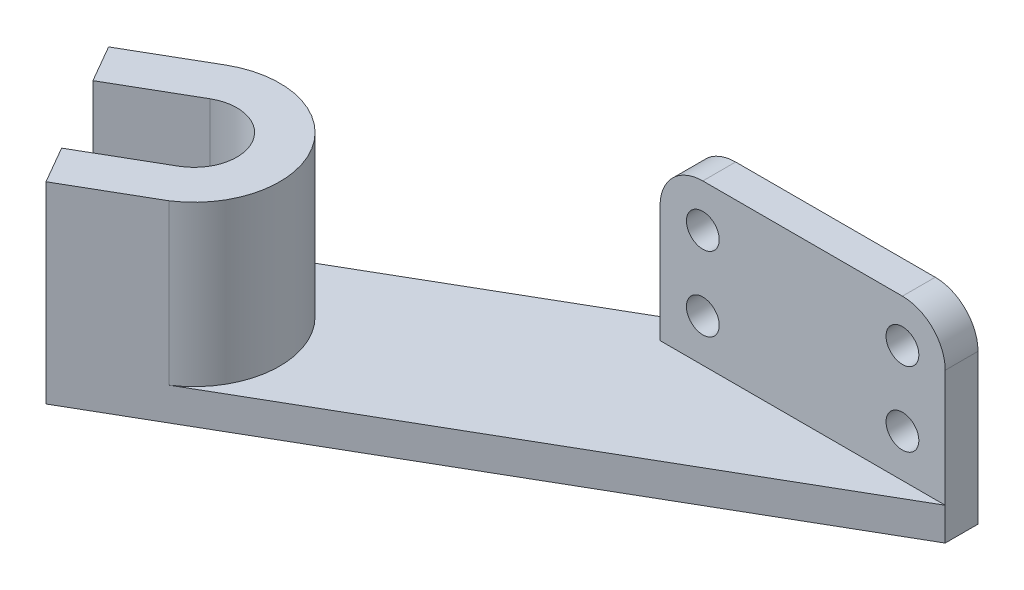
ISO-10303-21;
HEADER;
FILE_DESCRIPTION(('STEP AP214'),'2;1');
FILE_NAME('part.step','',(''),(''),'','','');
FILE_SCHEMA(('AUTOMOTIVE_DESIGN { 1 0 10303 214 1 1 1 1 }'));
ENDSEC;
DATA;
#1=APPLICATION_CONTEXT('core data for automotive mechanical design processes');
#2=APPLICATION_PROTOCOL_DEFINITION('international standard','automotive_design',2000,#1);
#3=PRODUCT_CONTEXT('',#1,'mechanical');
#4=PRODUCT('Part','Part','',(#3));
#5=PRODUCT_RELATED_PRODUCT_CATEGORY('part','',(#4));
#6=PRODUCT_DEFINITION_FORMATION('','',#4);
#7=PRODUCT_DEFINITION_CONTEXT('part definition',#1,'design');
#8=PRODUCT_DEFINITION('design','',#6,#7);
#9=PRODUCT_DEFINITION_SHAPE('','',#8);
#10=(LENGTH_UNIT() NAMED_UNIT(*) SI_UNIT(.MILLI.,.METRE.));
#11=(NAMED_UNIT(*) PLANE_ANGLE_UNIT() SI_UNIT($,.RADIAN.));
#12=(NAMED_UNIT(*) SI_UNIT($,.STERADIAN.) SOLID_ANGLE_UNIT());
#13=UNCERTAINTY_MEASURE_WITH_UNIT(LENGTH_MEASURE(1.E-05),#10,'distance_accuracy_value','');
#14=(GEOMETRIC_REPRESENTATION_CONTEXT(3) GLOBAL_UNCERTAINTY_ASSIGNED_CONTEXT((#13)) GLOBAL_UNIT_ASSIGNED_CONTEXT((#10,
#11,#12)) REPRESENTATION_CONTEXT('',''));
#15=CARTESIAN_POINT('',(0.,0.,0.));
#16=DIRECTION('',(0.,0.,1.));
#17=DIRECTION('',(1.,0.,0.));
#18=AXIS2_PLACEMENT_3D('',#15,#16,#17);
#19=CARTESIAN_POINT('',(-138.923048454132,-22.25,80.2307621135346));
#20=DIRECTION('',(0.,-1.,0.));
#21=DIRECTION('',(0.,0.,-1.));
#22=AXIS2_PLACEMENT_3D('',#19,#20,#21);
#23=PLANE('',#22);
#24=CARTESIAN_POINT('',(-138.923048454132,-22.25,80.2307621135346));
#25=DIRECTION('',(0.,1.,0.));
#26=DIRECTION('',(0.,0.,1.));
#27=AXIS2_PLACEMENT_3D('',#24,#25,#26);
#28=CIRCLE('',#27,30.0000000000023);
#29=CARTESIAN_POINT('',(-122.590401756136,-22.25,105.395114913449));
#30=VERTEX_POINT('',#29);
#31=CARTESIAN_POINT('',(-153.923048454133,-22.25,54.2499999999994));
#32=VERTEX_POINT('',#31);
#33=EDGE_CURVE('E50',#30,#32,#28,.T.);
#34=ORIENTED_EDGE('',*,*,#33,.F.);
#35=DIRECTION('',(-0.866025403784442,0.,0.499999999999995));
#36=VECTOR('',#35,1.);
#37=CARTESIAN_POINT('',(50.,-22.25,5.75));
#38=LINE('',#37,#36);
#39=CARTESIAN_POINT('',(50.,-22.25,5.75));
#40=VERTEX_POINT('',#39);
#41=EDGE_CURVE('E165',#40,#30,#38,.T.);
#42=ORIENTED_EDGE('',*,*,#41,.F.);
#43=DIRECTION('',(1.,0.,0.));
#44=VECTOR('',#43,1.);
#45=CARTESIAN_POINT('',(-50.,-22.25,5.75));
#46=LINE('',#45,#44);
#47=CARTESIAN_POINT('',(-50.,-22.25,5.75));
#48=VERTEX_POINT('',#47);
#49=EDGE_CURVE('E174',#48,#40,#46,.T.);
#50=ORIENTED_EDGE('',*,*,#49,.F.);
#51=DIRECTION('',(0.,0.,1.));
#52=VECTOR('',#51,1.);
#53=CARTESIAN_POINT('',(-50.,-22.25,-5.75));
#54=LINE('',#53,#52);
#55=CARTESIAN_POINT('',(-50.,-22.25,-5.75));
#56=VERTEX_POINT('',#55);
#57=EDGE_CURVE('E179',#56,#48,#54,.T.);
#58=ORIENTED_EDGE('',*,*,#57,.F.);
#59=DIRECTION('',(0.866025403784442,0.,-0.499999999999995));
#60=VECTOR('',#59,1.);
#61=CARTESIAN_POINT('',(-179.903810567666,-22.25,69.2499999999992));
#62=LINE('',#61,#60);
#63=EDGE_CURVE('E55',#32,#56,#62,.T.);
#64=ORIENTED_EDGE('',*,*,#63,.F.);
#65=EDGE_LOOP('',(#34,#42,#50,#58,#64));
#66=FACE_BOUND('',#65,.T.);
#67=ADVANCED_FACE('F35',(#66),#23,.F.);
#68=CARTESIAN_POINT('',(-50.,33.75,5.75));
#69=DIRECTION('',(1.,0.,0.));
#70=DIRECTION('',(0.,1.,0.));
#71=AXIS2_PLACEMENT_3D('',#68,#69,#70);
#72=PLANE('',#71);
#73=ORIENTED_EDGE('',*,*,#57,.T.);
#74=DIRECTION('',(0.,-1.,0.));
#75=VECTOR('',#74,1.);
#76=CARTESIAN_POINT('',(-50.,33.75,5.75));
#77=LINE('',#76,#75);
#78=CARTESIAN_POINT('',(-50.,18.75,5.75));
#79=VERTEX_POINT('',#78);
#80=EDGE_CURVE('E243',#79,#48,#77,.T.);
#81=ORIENTED_EDGE('',*,*,#80,.F.);
#82=DIRECTION('',(0.,0.,-1.));
#83=VECTOR('',#82,1.);
#84=CARTESIAN_POINT('',(-50.,18.75,5.75));
#85=LINE('',#84,#83);
#86=CARTESIAN_POINT('',(-50.,18.75,-5.75));
#87=VERTEX_POINT('',#86);
#88=EDGE_CURVE('E11',#79,#87,#85,.T.);
#89=ORIENTED_EDGE('',*,*,#88,.T.);
#90=DIRECTION('',(0.,-1.,0.));
#91=VECTOR('',#90,1.);
#92=CARTESIAN_POINT('',(-50.,33.75,-5.75));
#93=LINE('',#92,#91);
#94=EDGE_CURVE('E252',#87,#56,#93,.T.);
#95=ORIENTED_EDGE('',*,*,#94,.T.);
#96=EDGE_LOOP('',(#73,#81,#89,#95));
#97=FACE_BOUND('',#96,.T.);
#98=ADVANCED_FACE('F324',(#97),#72,.F.);
#99=CARTESIAN_POINT('',(0.,0.,5.75));
#100=DIRECTION('',(0.,0.,1.));
#101=DIRECTION('',(1.,0.,0.));
#102=AXIS2_PLACEMENT_3D('',#99,#100,#101);
#103=PLANE('',#102);
#104=CARTESIAN_POINT('',(-35.,18.75,5.75));
#105=DIRECTION('',(0.,0.,1.));
#106=DIRECTION('',(1.,0.,0.));
#107=AXIS2_PLACEMENT_3D('',#104,#105,#106);
#108=CIRCLE('',#107,5.74999999999999);
#109=CARTESIAN_POINT('',(-29.25,18.75,5.75));
#110=VERTEX_POINT('',#109);
#111=EDGE_CURVE('E197',#110,#110,#108,.T.);
#112=ORIENTED_EDGE('',*,*,#111,.F.);
#113=EDGE_LOOP('',(#112));
#114=FACE_BOUND('',#113,.T.);
#115=CARTESIAN_POINT('',(35.,18.75,5.75));
#116=DIRECTION('',(0.,0.,1.));
#117=DIRECTION('',(1.,0.,0.));
#118=AXIS2_PLACEMENT_3D('',#115,#116,#117);
#119=CIRCLE('',#118,5.74999999999999);
#120=CARTESIAN_POINT('',(40.75,18.75,5.75));
#121=VERTEX_POINT('',#120);
#122=EDGE_CURVE('E218',#121,#121,#119,.T.);
#123=ORIENTED_EDGE('',*,*,#122,.F.);
#124=EDGE_LOOP('',(#123));
#125=FACE_BOUND('',#124,.T.);
#126=CARTESIAN_POINT('',(-35.,-7.25000000000001,5.75));
#127=DIRECTION('',(0.,0.,1.));
#128=DIRECTION('',(1.,0.,0.));
#129=AXIS2_PLACEMENT_3D('',#126,#127,#128);
#130=CIRCLE('',#129,5.74999999999999);
#131=CARTESIAN_POINT('',(-29.25,-7.25000000000001,5.75));
#132=VERTEX_POINT('',#131);
#133=EDGE_CURVE('E224',#132,#132,#130,.T.);
#134=ORIENTED_EDGE('',*,*,#133,.F.);
#135=EDGE_LOOP('',(#134));
#136=FACE_BOUND('',#135,.T.);
#137=CARTESIAN_POINT('',(35.,-7.24999999999999,5.75));
#138=DIRECTION('',(0.,0.,1.));
#139=DIRECTION('',(1.,0.,0.));
#140=AXIS2_PLACEMENT_3D('',#137,#138,#139);
#141=CIRCLE('',#140,5.74999999999999);
#142=CARTESIAN_POINT('',(40.75,-7.24999999999999,5.75));
#143=VERTEX_POINT('',#142);
#144=EDGE_CURVE('E230',#143,#143,#141,.T.);
#145=ORIENTED_EDGE('',*,*,#144,.F.);
#146=EDGE_LOOP('',(#145));
#147=FACE_BOUND('',#146,.T.);
#148=ORIENTED_EDGE('',*,*,#80,.T.);
#149=ORIENTED_EDGE('',*,*,#49,.T.);
#150=DIRECTION('',(0.,1.,0.));
#151=VECTOR('',#150,1.);
#152=CARTESIAN_POINT('',(50.,33.75,5.75));
#153=LINE('',#152,#151);
#154=CARTESIAN_POINT('',(50.,18.75,5.75));
#155=VERTEX_POINT('',#154);
#156=EDGE_CURVE('E240',#40,#155,#153,.T.);
#157=ORIENTED_EDGE('',*,*,#156,.T.);
#158=CARTESIAN_POINT('',(35.,18.75,5.75));
#159=DIRECTION('',(0.,0.,1.));
#160=DIRECTION('',(1.,0.,0.));
#161=AXIS2_PLACEMENT_3D('',#158,#159,#160);
#162=CIRCLE('',#161,15.);
#163=CARTESIAN_POINT('',(35.,33.75,5.75));
#164=VERTEX_POINT('',#163);
#165=EDGE_CURVE('E43',#155,#164,#162,.T.);
#166=ORIENTED_EDGE('',*,*,#165,.T.);
#167=DIRECTION('',(-1.,0.,0.));
#168=VECTOR('',#167,1.);
#169=CARTESIAN_POINT('',(-50.,33.75,5.75));
#170=LINE('',#169,#168);
#171=CARTESIAN_POINT('',(-35.,33.75,5.75));
#172=VERTEX_POINT('',#171);
#173=EDGE_CURVE('E239',#164,#172,#170,.T.);
#174=ORIENTED_EDGE('',*,*,#173,.T.);
#175=CARTESIAN_POINT('',(-35.,18.75,5.75));
#176=DIRECTION('',(0.,0.,1.));
#177=DIRECTION('',(1.,0.,0.));
#178=AXIS2_PLACEMENT_3D('',#175,#176,#177);
#179=CIRCLE('',#178,15.);
#180=EDGE_CURVE('E271',#172,#79,#179,.T.);
#181=ORIENTED_EDGE('',*,*,#180,.T.);
#182=EDGE_LOOP('',(#148,#149,#157,#166,#174,#181));
#183=FACE_BOUND('',#182,.T.);
#184=ADVANCED_FACE('F275',(#114,#125,#136,#147,#183),#103,.T.);
#185=CARTESIAN_POINT('',(50.,33.75,5.75));
#186=DIRECTION('',(-1.,0.,0.));
#187=DIRECTION('',(0.,-1.,0.));
#188=AXIS2_PLACEMENT_3D('',#185,#186,#187);
#189=PLANE('',#188);
#190=DIRECTION('',(0.,1.,0.));
#191=VECTOR('',#190,1.);
#192=CARTESIAN_POINT('',(50.,33.75,-5.75));
#193=LINE('',#192,#191);
#194=CARTESIAN_POINT('',(50.,-33.75,-5.75));
#195=VERTEX_POINT('',#194);
#196=CARTESIAN_POINT('',(50.,18.75,-5.75));
#197=VERTEX_POINT('',#196);
#198=EDGE_CURVE('E236',#195,#197,#193,.T.);
#199=ORIENTED_EDGE('',*,*,#198,.T.);
#200=DIRECTION('',(0.,0.,-1.));
#201=VECTOR('',#200,1.);
#202=CARTESIAN_POINT('',(50.,18.75,5.75));
#203=LINE('',#202,#201);
#204=EDGE_CURVE('E268',#197,#155,#203,.F.);
#205=ORIENTED_EDGE('',*,*,#204,.T.);
#206=ORIENTED_EDGE('',*,*,#156,.F.);
#207=CARTESIAN_POINT('',(50.,-33.75,5.75));
#208=VERTEX_POINT('',#207);
#209=EDGE_CURVE('E237',#208,#40,#153,.T.);
#210=ORIENTED_EDGE('',*,*,#209,.F.);
#211=DIRECTION('',(0.,0.,-1.));
#212=VECTOR('',#211,1.);
#213=CARTESIAN_POINT('',(50.,-33.75,5.75));
#214=LINE('',#213,#212);
#215=EDGE_CURVE('E246',#208,#195,#214,.T.);
#216=ORIENTED_EDGE('',*,*,#215,.T.);
#217=EDGE_LOOP('',(#199,#205,#206,#210,#216));
#218=FACE_BOUND('',#217,.T.);
#219=ADVANCED_FACE('F290',(#218),#189,.F.);
#220=CARTESIAN_POINT('',(-50.,33.75,5.75));
#221=DIRECTION('',(0.,-1.,0.));
#222=DIRECTION('',(0.,0.,-1.));
#223=AXIS2_PLACEMENT_3D('',#220,#221,#222);
#224=PLANE('',#223);
#225=ORIENTED_EDGE('',*,*,#173,.F.);
#226=DIRECTION('',(0.,0.,-1.));
#227=VECTOR('',#226,1.);
#228=CARTESIAN_POINT('',(35.,33.75,5.75));
#229=LINE('',#228,#227);
#230=CARTESIAN_POINT('',(35.,33.75,-5.75));
#231=VERTEX_POINT('',#230);
#232=EDGE_CURVE('E261',#164,#231,#229,.T.);
#233=ORIENTED_EDGE('',*,*,#232,.T.);
#234=DIRECTION('',(-1.,0.,0.));
#235=VECTOR('',#234,1.);
#236=CARTESIAN_POINT('',(-50.,33.75,-5.75));
#237=LINE('',#236,#235);
#238=CARTESIAN_POINT('',(-35.,33.75,-5.75));
#239=VERTEX_POINT('',#238);
#240=EDGE_CURVE('E249',#231,#239,#237,.T.);
#241=ORIENTED_EDGE('',*,*,#240,.T.);
#242=DIRECTION('',(0.,0.,-1.));
#243=VECTOR('',#242,1.);
#244=CARTESIAN_POINT('',(-35.,33.75,5.75));
#245=LINE('',#244,#243);
#246=EDGE_CURVE('E259',#239,#172,#245,.F.);
#247=ORIENTED_EDGE('',*,*,#246,.T.);
#248=EDGE_LOOP('',(#225,#233,#241,#247));
#249=FACE_BOUND('',#248,.T.);
#250=ADVANCED_FACE('F282',(#249),#224,.F.);
#251=CARTESIAN_POINT('',(-50.,-33.75,5.75));
#252=DIRECTION('',(0.,1.,0.));
#253=DIRECTION('',(0.,0.,1.));
#254=AXIS2_PLACEMENT_3D('',#251,#252,#253);
#255=PLANE('',#254);
#256=DIRECTION('',(0.866025403784442,0.,-0.499999999999995));
#257=VECTOR('',#256,1.);
#258=CARTESIAN_POINT('',(-179.903810567666,-33.75,69.2499999999992));
#259=LINE('',#258,#257);
#260=CARTESIAN_POINT('',(-179.903810567666,-33.75,69.2499999999992));
#261=VERTEX_POINT('',#260);
#262=CARTESIAN_POINT('',(-50.,-33.75,-5.75));
#263=VERTEX_POINT('',#262);
#264=EDGE_CURVE('E176',#261,#263,#259,.T.);
#265=ORIENTED_EDGE('',*,*,#264,.T.);
#266=DIRECTION('',(1.,0.,0.));
#267=VECTOR('',#266,1.);
#268=CARTESIAN_POINT('',(-50.,-33.75,-5.75));
#269=LINE('',#268,#267);
#270=EDGE_CURVE('E255',#263,#195,#269,.T.);
#271=ORIENTED_EDGE('',*,*,#270,.T.);
#272=ORIENTED_EDGE('',*,*,#215,.F.);
#273=DIRECTION('',(-0.866025403784442,0.,0.499999999999995));
#274=VECTOR('',#273,1.);
#275=CARTESIAN_POINT('',(50.,-33.75,5.75));
#276=LINE('',#275,#274);
#277=CARTESIAN_POINT('',(-149.924164495906,-33.75,121.176270189221));
#278=VERTEX_POINT('',#277);
#279=EDGE_CURVE('E166',#208,#278,#276,.T.);
#280=ORIENTED_EDGE('',*,*,#279,.T.);
#281=DIRECTION('',(0.499999999999995,0.,0.866025403784442));
#282=VECTOR('',#281,1.);
#283=CARTESIAN_POINT('',(-157.403810567665,-33.75,108.221143170301));
#284=LINE('',#283,#282);
#285=CARTESIAN_POINT('',(-157.403810567665,-33.75,108.221143170301));
#286=VERTEX_POINT('',#285);
#287=EDGE_CURVE('E169',#286,#278,#284,.T.);
#288=ORIENTED_EDGE('',*,*,#287,.F.);
#289=DIRECTION('',(-0.866025403784442,0.,0.499999999999994));
#290=VECTOR('',#289,1.);
#291=CARTESIAN_POINT('',(-131.423048454132,-33.75,93.2211431703012));
#292=LINE('',#291,#290);
#293=CARTESIAN_POINT('',(-131.423048454132,-33.75,93.2211431703012));
#294=VERTEX_POINT('',#293);
#295=EDGE_CURVE('E184',#294,#286,#292,.T.);
#296=ORIENTED_EDGE('',*,*,#295,.F.);
#297=CARTESIAN_POINT('',(-138.923048454132,-33.75,80.2307621135346));
#298=DIRECTION('',(0.,-1.,0.));
#299=DIRECTION('',(0.,0.,-1.));
#300=AXIS2_PLACEMENT_3D('',#297,#298,#299);
#301=CIRCLE('',#300,15.);
#302=CARTESIAN_POINT('',(-146.423048454132,-33.75,67.240381056768));
#303=VERTEX_POINT('',#302);
#304=EDGE_CURVE('E186',#303,#294,#301,.T.);
#305=ORIENTED_EDGE('',*,*,#304,.F.);
#306=DIRECTION('',(0.866025403784441,0.,-0.499999999999995));
#307=VECTOR('',#306,1.);
#308=CARTESIAN_POINT('',(-172.403810567665,-33.75,82.2403810567678));
#309=LINE('',#308,#307);
#310=CARTESIAN_POINT('',(-172.403810567665,-33.75,82.2403810567678));
#311=VERTEX_POINT('',#310);
#312=EDGE_CURVE('E188',#311,#303,#309,.T.);
#313=ORIENTED_EDGE('',*,*,#312,.F.);
#314=DIRECTION('',(0.499999999999995,0.,0.866025403784441));
#315=VECTOR('',#314,1.);
#316=CARTESIAN_POINT('',(-179.903810567666,-33.75,69.2499999999992));
#317=LINE('',#316,#315);
#318=EDGE_CURVE('E190',#261,#311,#317,.T.);
#319=ORIENTED_EDGE('',*,*,#318,.F.);
#320=EDGE_LOOP('',(#265,#271,#272,#280,#288,#296,#305,#313,#319));
#321=FACE_BOUND('',#320,.T.);
#322=ADVANCED_FACE('F293',(#321),#255,.F.);
#323=CARTESIAN_POINT('',(0.,0.,-5.75));
#324=DIRECTION('',(0.,0.,1.));
#325=DIRECTION('',(1.,0.,0.));
#326=AXIS2_PLACEMENT_3D('',#323,#324,#325);
#327=PLANE('',#326);
#328=CARTESIAN_POINT('',(-35.,18.75,-5.75));
#329=DIRECTION('',(0.,0.,1.));
#330=DIRECTION('',(1.,0.,0.));
#331=AXIS2_PLACEMENT_3D('',#328,#329,#330);
#332=CIRCLE('',#331,5.75);
#333=CARTESIAN_POINT('',(-29.25,18.75,-5.75));
#334=VERTEX_POINT('',#333);
#335=EDGE_CURVE('E215',#334,#334,#332,.T.);
#336=ORIENTED_EDGE('',*,*,#335,.T.);
#337=EDGE_LOOP('',(#336));
#338=FACE_BOUND('',#337,.T.);
#339=CARTESIAN_POINT('',(35.,18.75,-5.75));
#340=DIRECTION('',(0.,0.,1.));
#341=DIRECTION('',(1.,0.,0.));
#342=AXIS2_PLACEMENT_3D('',#339,#340,#341);
#343=CIRCLE('',#342,5.75);
#344=CARTESIAN_POINT('',(40.75,18.75,-5.75));
#345=VERTEX_POINT('',#344);
#346=EDGE_CURVE('E221',#345,#345,#343,.T.);
#347=ORIENTED_EDGE('',*,*,#346,.T.);
#348=EDGE_LOOP('',(#347));
#349=FACE_BOUND('',#348,.T.);
#350=CARTESIAN_POINT('',(-35.,-7.25000000000001,-5.75));
#351=DIRECTION('',(0.,0.,1.));
#352=DIRECTION('',(1.,0.,0.));
#353=AXIS2_PLACEMENT_3D('',#350,#351,#352);
#354=CIRCLE('',#353,5.75);
#355=CARTESIAN_POINT('',(-29.25,-7.25000000000001,-5.75));
#356=VERTEX_POINT('',#355);
#357=EDGE_CURVE('E227',#356,#356,#354,.T.);
#358=ORIENTED_EDGE('',*,*,#357,.T.);
#359=EDGE_LOOP('',(#358));
#360=FACE_BOUND('',#359,.T.);
#361=CARTESIAN_POINT('',(35.,-7.24999999999999,-5.75));
#362=DIRECTION('',(0.,0.,1.));
#363=DIRECTION('',(1.,0.,0.));
#364=AXIS2_PLACEMENT_3D('',#361,#362,#363);
#365=CIRCLE('',#364,5.75);
#366=CARTESIAN_POINT('',(40.75,-7.24999999999999,-5.75));
#367=VERTEX_POINT('',#366);
#368=EDGE_CURVE('E233',#367,#367,#365,.T.);
#369=ORIENTED_EDGE('',*,*,#368,.T.);
#370=EDGE_LOOP('',(#369));
#371=FACE_BOUND('',#370,.T.);
#372=ORIENTED_EDGE('',*,*,#240,.F.);
#373=CARTESIAN_POINT('',(35.,18.75,-5.75));
#374=DIRECTION('',(0.,0.,1.));
#375=DIRECTION('',(1.,0.,0.));
#376=AXIS2_PLACEMENT_3D('',#373,#374,#375);
#377=CIRCLE('',#376,15.);
#378=EDGE_CURVE('E266',#231,#197,#377,.F.);
#379=ORIENTED_EDGE('',*,*,#378,.T.);
#380=ORIENTED_EDGE('',*,*,#198,.F.);
#381=ORIENTED_EDGE('',*,*,#270,.F.);
#382=DIRECTION('',(0.,-1.,0.));
#383=VECTOR('',#382,1.);
#384=CARTESIAN_POINT('',(-50.,-22.25,-5.75));
#385=LINE('',#384,#383);
#386=EDGE_CURVE('E194',#56,#263,#385,.T.);
#387=ORIENTED_EDGE('',*,*,#386,.F.);
#388=ORIENTED_EDGE('',*,*,#94,.F.);
#389=CARTESIAN_POINT('',(-35.,18.75,-5.75));
#390=DIRECTION('',(0.,0.,1.));
#391=DIRECTION('',(1.,0.,0.));
#392=AXIS2_PLACEMENT_3D('',#389,#390,#391);
#393=CIRCLE('',#392,15.);
#394=EDGE_CURVE('E264',#87,#239,#393,.F.);
#395=ORIENTED_EDGE('',*,*,#394,.T.);
#396=EDGE_LOOP('',(#372,#379,#380,#381,#387,#388,#395));
#397=FACE_BOUND('',#396,.T.);
#398=ADVANCED_FACE('F288',(#338,#349,#360,#371,#397),#327,.F.);
#399=CARTESIAN_POINT('',(35.,18.75,5.75));
#400=DIRECTION('',(0.,0.,-1.));
#401=DIRECTION('',(-1.,0.,0.));
#402=AXIS2_PLACEMENT_3D('',#399,#400,#401);
#403=CYLINDRICAL_SURFACE('',#402,15.);
#404=ORIENTED_EDGE('',*,*,#165,.F.);
#405=ORIENTED_EDGE('',*,*,#204,.F.);
#406=ORIENTED_EDGE('',*,*,#378,.F.);
#407=ORIENTED_EDGE('',*,*,#232,.F.);
#408=EDGE_LOOP('',(#404,#405,#406,#407));
#409=FACE_BOUND('',#408,.T.);
#410=ADVANCED_FACE('F285',(#409),#403,.T.);
#411=CARTESIAN_POINT('',(-35.,18.75,5.75));
#412=DIRECTION('',(0.,0.,-1.));
#413=DIRECTION('',(-1.,0.,0.));
#414=AXIS2_PLACEMENT_3D('',#411,#412,#413);
#415=CYLINDRICAL_SURFACE('',#414,15.);
#416=ORIENTED_EDGE('',*,*,#180,.F.);
#417=ORIENTED_EDGE('',*,*,#246,.F.);
#418=ORIENTED_EDGE('',*,*,#394,.F.);
#419=ORIENTED_EDGE('',*,*,#88,.F.);
#420=EDGE_LOOP('',(#416,#417,#418,#419));
#421=FACE_BOUND('',#420,.T.);
#422=ADVANCED_FACE('F37',(#421),#415,.T.);
#423=CARTESIAN_POINT('',(35.,-7.24999999999999,5.75));
#424=DIRECTION('',(0.,0.,1.));
#425=DIRECTION('',(1.,0.,0.));
#426=AXIS2_PLACEMENT_3D('',#423,#424,#425);
#427=CYLINDRICAL_SURFACE('',#426,5.74999999999999);
#428=ORIENTED_EDGE('',*,*,#368,.F.);
#429=EDGE_LOOP('',(#428));
#430=FACE_BOUND('',#429,.T.);
#431=ORIENTED_EDGE('',*,*,#144,.T.);
#432=EDGE_LOOP('',(#431));
#433=FACE_BOUND('',#432,.T.);
#434=ADVANCED_FACE('F327',(#430,#433),#427,.F.);
#435=CARTESIAN_POINT('',(-35.,-7.25000000000001,5.75));
#436=DIRECTION('',(0.,0.,1.));
#437=DIRECTION('',(1.,0.,0.));
#438=AXIS2_PLACEMENT_3D('',#435,#436,#437);
#439=CYLINDRICAL_SURFACE('',#438,5.74999999999999);
#440=ORIENTED_EDGE('',*,*,#357,.F.);
#441=EDGE_LOOP('',(#440));
#442=FACE_BOUND('',#441,.T.);
#443=ORIENTED_EDGE('',*,*,#133,.T.);
#444=EDGE_LOOP('',(#443));
#445=FACE_BOUND('',#444,.T.);
#446=ADVANCED_FACE('F332',(#442,#445),#439,.F.);
#447=CARTESIAN_POINT('',(35.,18.75,5.75));
#448=DIRECTION('',(0.,0.,1.));
#449=DIRECTION('',(1.,0.,0.));
#450=AXIS2_PLACEMENT_3D('',#447,#448,#449);
#451=CYLINDRICAL_SURFACE('',#450,5.74999999999999);
#452=ORIENTED_EDGE('',*,*,#346,.F.);
#453=EDGE_LOOP('',(#452));
#454=FACE_BOUND('',#453,.T.);
#455=ORIENTED_EDGE('',*,*,#122,.T.);
#456=EDGE_LOOP('',(#455));
#457=FACE_BOUND('',#456,.T.);
#458=ADVANCED_FACE('F368',(#454,#457),#451,.F.);
#459=CARTESIAN_POINT('',(-35.,18.75,5.75));
#460=DIRECTION('',(0.,0.,1.));
#461=DIRECTION('',(1.,0.,0.));
#462=AXIS2_PLACEMENT_3D('',#459,#460,#461);
#463=CYLINDRICAL_SURFACE('',#462,5.74999999999999);
#464=ORIENTED_EDGE('',*,*,#335,.F.);
#465=EDGE_LOOP('',(#464));
#466=FACE_BOUND('',#465,.T.);
#467=ORIENTED_EDGE('',*,*,#111,.T.);
#468=EDGE_LOOP('',(#467));
#469=FACE_BOUND('',#468,.T.);
#470=ADVANCED_FACE('F347',(#466,#469),#463,.F.);
#471=CARTESIAN_POINT('',(-179.903810567666,-22.25,69.2499999999992));
#472=DIRECTION('',(-0.499999999999995,0.,-0.866025403784442));
#473=DIRECTION('',(-0.866025403784442,0.,0.499999999999995));
#474=AXIS2_PLACEMENT_3D('',#471,#472,#473);
#475=PLANE('',#474);
#476=ORIENTED_EDGE('',*,*,#264,.F.);
#477=DIRECTION('',(0.,-1.,0.));
#478=VECTOR('',#477,1.);
#479=CARTESIAN_POINT('',(-179.903810567666,-22.25,69.2499999999992));
#480=LINE('',#479,#478);
#481=CARTESIAN_POINT('',(-179.903810567666,33.75,69.2499999999992));
#482=VERTEX_POINT('',#481);
#483=EDGE_CURVE('E198',#482,#261,#480,.T.);
#484=ORIENTED_EDGE('',*,*,#483,.F.);
#485=DIRECTION('',(-0.866025403784442,0.,0.499999999999995));
#486=VECTOR('',#485,1.);
#487=CARTESIAN_POINT('',(-14.98982303588,33.75,-25.9631350946109));
#488=LINE('',#487,#486);
#489=CARTESIAN_POINT('',(-153.923048454133,33.75,54.2499999999994));
#490=VERTEX_POINT('',#489);
#491=EDGE_CURVE('E151',#490,#482,#488,.T.);
#492=ORIENTED_EDGE('',*,*,#491,.F.);
#493=DIRECTION('',(0.,-1.,0.));
#494=VECTOR('',#493,1.);
#495=CARTESIAN_POINT('',(-153.923048454133,33.75,54.2499999999994));
#496=LINE('',#495,#494);
#497=EDGE_CURVE('E147',#490,#32,#496,.T.);
#498=ORIENTED_EDGE('',*,*,#497,.T.);
#499=ORIENTED_EDGE('',*,*,#63,.T.);
#500=ORIENTED_EDGE('',*,*,#386,.T.);
#501=EDGE_LOOP('',(#476,#484,#492,#498,#499,#500));
#502=FACE_BOUND('',#501,.T.);
#503=ADVANCED_FACE('F300',(#502),#475,.T.);
#504=CARTESIAN_POINT('',(-179.903810567666,-22.25,69.2499999999992));
#505=DIRECTION('',(0.866025403784441,0.,-0.499999999999995));
#506=DIRECTION('',(-0.499999999999995,0.,-0.866025403784441));
#507=AXIS2_PLACEMENT_3D('',#504,#505,#506);
#508=PLANE('',#507);
#509=ORIENTED_EDGE('',*,*,#318,.T.);
#510=DIRECTION('',(0.,-1.,0.));
#511=VECTOR('',#510,1.);
#512=CARTESIAN_POINT('',(-172.403810567665,-22.25,82.2403810567678));
#513=LINE('',#512,#511);
#514=CARTESIAN_POINT('',(-172.403810567665,33.75,82.2403810567679));
#515=VERTEX_POINT('',#514);
#516=EDGE_CURVE('E200',#515,#311,#513,.T.);
#517=ORIENTED_EDGE('',*,*,#516,.F.);
#518=DIRECTION('',(0.499999999999995,0.,0.866025403784441));
#519=VECTOR('',#518,1.);
#520=CARTESIAN_POINT('',(-164.913987531786,33.75,95.2131350946101));
#521=LINE('',#520,#519);
#522=EDGE_CURVE('E303',#482,#515,#521,.T.);
#523=ORIENTED_EDGE('',*,*,#522,.F.);
#524=ORIENTED_EDGE('',*,*,#483,.T.);
#525=EDGE_LOOP('',(#509,#517,#523,#524));
#526=FACE_BOUND('',#525,.T.);
#527=ADVANCED_FACE('F346',(#526),#508,.F.);
#528=CARTESIAN_POINT('',(-172.403810567665,-22.25,82.2403810567678));
#529=DIRECTION('',(-0.499999999999995,0.,-0.866025403784441));
#530=DIRECTION('',(-0.866025403784441,0.,0.499999999999995));
#531=AXIS2_PLACEMENT_3D('',#528,#529,#530);
#532=PLANE('',#531);
#533=ORIENTED_EDGE('',*,*,#312,.T.);
#534=DIRECTION('',(0.,-1.,0.));
#535=VECTOR('',#534,1.);
#536=CARTESIAN_POINT('',(-146.423048454132,-22.25,67.240381056768));
#537=LINE('',#536,#535);
#538=CARTESIAN_POINT('',(-146.423048454132,33.75,67.240381056768));
#539=VERTEX_POINT('',#538);
#540=EDGE_CURVE('E203',#539,#303,#537,.T.);
#541=ORIENTED_EDGE('',*,*,#540,.F.);
#542=DIRECTION('',(0.866025403784441,0.,-0.499999999999995));
#543=VECTOR('',#542,1.);
#544=CARTESIAN_POINT('',(-7.48982303587896,33.75,-12.9727540378423));
#545=LINE('',#544,#543);
#546=EDGE_CURVE('E305',#515,#539,#545,.T.);
#547=ORIENTED_EDGE('',*,*,#546,.F.);
#548=ORIENTED_EDGE('',*,*,#516,.T.);
#549=EDGE_LOOP('',(#533,#541,#547,#548));
#550=FACE_BOUND('',#549,.T.);
#551=ADVANCED_FACE('F350',(#550),#532,.F.);
#552=CARTESIAN_POINT('',(-138.923048454132,-22.25,80.2307621135346));
#553=DIRECTION('',(0.,-1.,0.));
#554=DIRECTION('',(0.,0.,-1.));
#555=AXIS2_PLACEMENT_3D('',#552,#553,#554);
#556=CYLINDRICAL_SURFACE('',#555,15.);
#557=ORIENTED_EDGE('',*,*,#304,.T.);
#558=DIRECTION('',(0.,-1.,0.));
#559=VECTOR('',#558,1.);
#560=CARTESIAN_POINT('',(-131.423048454132,-22.25,93.2211431703012));
#561=LINE('',#560,#559);
#562=CARTESIAN_POINT('',(-131.423048454132,33.75,93.2211431703012));
#563=VERTEX_POINT('',#562);
#564=EDGE_CURVE('E206',#563,#294,#561,.T.);
#565=ORIENTED_EDGE('',*,*,#564,.F.);
#566=CARTESIAN_POINT('',(-138.923048454132,33.75,80.2307621135346));
#567=DIRECTION('',(0.,1.,0.));
#568=DIRECTION('',(0.,0.,1.));
#569=AXIS2_PLACEMENT_3D('',#566,#567,#568);
#570=CIRCLE('',#569,15.);
#571=EDGE_CURVE('E310',#539,#563,#570,.F.);
#572=ORIENTED_EDGE('',*,*,#571,.F.);
#573=ORIENTED_EDGE('',*,*,#540,.T.);
#574=EDGE_LOOP('',(#557,#565,#572,#573));
#575=FACE_BOUND('',#574,.T.);
#576=ADVANCED_FACE('F354',(#575),#556,.F.);
#577=CARTESIAN_POINT('',(-131.423048454132,-22.25,93.2211431703012));
#578=DIRECTION('',(0.499999999999994,0.,0.866025403784442));
#579=DIRECTION('',(0.866025403784442,0.,-0.499999999999994));
#580=AXIS2_PLACEMENT_3D('',#577,#578,#579);
#581=PLANE('',#580);
#582=ORIENTED_EDGE('',*,*,#295,.T.);
#583=DIRECTION('',(0.,-1.,0.));
#584=VECTOR('',#583,1.);
#585=CARTESIAN_POINT('',(-157.403810567665,-22.25,108.221143170301));
#586=LINE('',#585,#584);
#587=CARTESIAN_POINT('',(-157.403810567665,33.75,108.221143170301));
#588=VERTEX_POINT('',#587);
#589=EDGE_CURVE('E209',#588,#286,#586,.T.);
#590=ORIENTED_EDGE('',*,*,#589,.F.);
#591=DIRECTION('',(-0.866025403784442,0.,0.499999999999994));
#592=VECTOR('',#591,1.);
#593=CARTESIAN_POINT('',(7.51017696412096,33.75,13.0080080756911));
#594=LINE('',#593,#592);
#595=EDGE_CURVE('E313',#563,#588,#594,.T.);
#596=ORIENTED_EDGE('',*,*,#595,.F.);
#597=ORIENTED_EDGE('',*,*,#564,.T.);
#598=EDGE_LOOP('',(#582,#590,#596,#597));
#599=FACE_BOUND('',#598,.T.);
#600=ADVANCED_FACE('F358',(#599),#581,.F.);
#601=CARTESIAN_POINT('',(-157.403810567665,-22.25,108.221143170301));
#602=DIRECTION('',(0.866025403784442,0.,-0.499999999999995));
#603=DIRECTION('',(-0.499999999999995,0.,-0.866025403784442));
#604=AXIS2_PLACEMENT_3D('',#601,#602,#603);
#605=PLANE('',#604);
#606=ORIENTED_EDGE('',*,*,#287,.T.);
#607=DIRECTION('',(0.,-1.,0.));
#608=VECTOR('',#607,1.);
#609=CARTESIAN_POINT('',(-149.924164495906,-22.25,121.176270189221));
#610=LINE('',#609,#608);
#611=CARTESIAN_POINT('',(-149.924164495906,33.75,121.176270189221));
#612=VERTEX_POINT('',#611);
#613=EDGE_CURVE('E180',#612,#278,#610,.T.);
#614=ORIENTED_EDGE('',*,*,#613,.F.);
#615=DIRECTION('',(0.499999999999995,0.,0.866025403784442));
#616=VECTOR('',#615,1.);
#617=CARTESIAN_POINT('',(-164.913987531786,33.75,95.2131350946101));
#618=LINE('',#617,#616);
#619=EDGE_CURVE('E159',#588,#612,#618,.T.);
#620=ORIENTED_EDGE('',*,*,#619,.F.);
#621=ORIENTED_EDGE('',*,*,#589,.T.);
#622=EDGE_LOOP('',(#606,#614,#620,#621));
#623=FACE_BOUND('',#622,.T.);
#624=ADVANCED_FACE('F319',(#623),#605,.F.);
#625=CARTESIAN_POINT('',(50.,-22.25,5.75));
#626=DIRECTION('',(0.499999999999995,0.,0.866025403784442));
#627=DIRECTION('',(0.866025403784442,0.,-0.499999999999995));
#628=AXIS2_PLACEMENT_3D('',#625,#626,#627);
#629=PLANE('',#628);
#630=ORIENTED_EDGE('',*,*,#279,.F.);
#631=ORIENTED_EDGE('',*,*,#209,.T.);
#632=ORIENTED_EDGE('',*,*,#41,.T.);
#633=DIRECTION('',(0.,-1.,0.));
#634=VECTOR('',#633,1.);
#635=CARTESIAN_POINT('',(-122.590401756136,33.75,105.395114913449));
#636=LINE('',#635,#634);
#637=CARTESIAN_POINT('',(-122.590401756136,33.75,105.395114913449));
#638=VERTEX_POINT('',#637);
#639=EDGE_CURVE('E145',#638,#30,#636,.T.);
#640=ORIENTED_EDGE('',*,*,#639,.F.);
#641=DIRECTION('',(0.866025403784442,0.,-0.499999999999995));
#642=VECTOR('',#641,1.);
#643=CARTESIAN_POINT('',(14.98982303588,33.75,25.9631350946108));
#644=LINE('',#643,#642);
#645=EDGE_CURVE('E152',#612,#638,#644,.T.);
#646=ORIENTED_EDGE('',*,*,#645,.F.);
#647=ORIENTED_EDGE('',*,*,#613,.T.);
#648=EDGE_LOOP('',(#630,#631,#632,#640,#646,#647));
#649=FACE_BOUND('',#648,.T.);
#650=ADVANCED_FACE('F163',(#649),#629,.T.);
#651=CARTESIAN_POINT('',(-138.923048454132,33.75,80.2307621135346));
#652=DIRECTION('',(0.,-1.,0.));
#653=DIRECTION('',(0.,0.,-1.));
#654=AXIS2_PLACEMENT_3D('',#651,#652,#653);
#655=CYLINDRICAL_SURFACE('',#654,30.0000000000023);
#656=ORIENTED_EDGE('',*,*,#33,.T.);
#657=ORIENTED_EDGE('',*,*,#497,.F.);
#658=CARTESIAN_POINT('',(-138.923048454132,33.75,80.2307621135346));
#659=DIRECTION('',(0.,1.,0.));
#660=DIRECTION('',(0.,0.,1.));
#661=AXIS2_PLACEMENT_3D('',#658,#659,#660);
#662=CIRCLE('',#661,30.0000000000023);
#663=EDGE_CURVE('E141',#638,#490,#662,.T.);
#664=ORIENTED_EDGE('',*,*,#663,.F.);
#665=ORIENTED_EDGE('',*,*,#639,.T.);
#666=EDGE_LOOP('',(#656,#657,#664,#665));
#667=FACE_BOUND('',#666,.T.);
#668=ADVANCED_FACE('F143',(#667),#655,.T.);
#669=CARTESIAN_POINT('',(0.,33.75,0.));
#670=DIRECTION('',(0.,1.,0.));
#671=DIRECTION('',(0.,0.,1.));
#672=AXIS2_PLACEMENT_3D('',#669,#670,#671);
#673=PLANE('',#672);
#674=ORIENTED_EDGE('',*,*,#645,.T.);
#675=ORIENTED_EDGE('',*,*,#663,.T.);
#676=ORIENTED_EDGE('',*,*,#491,.T.);
#677=ORIENTED_EDGE('',*,*,#522,.T.);
#678=ORIENTED_EDGE('',*,*,#546,.T.);
#679=ORIENTED_EDGE('',*,*,#571,.T.);
#680=ORIENTED_EDGE('',*,*,#595,.T.);
#681=ORIENTED_EDGE('',*,*,#619,.T.);
#682=EDGE_LOOP('',(#674,#675,#676,#677,#678,#679,#680,#681));
#683=FACE_BOUND('',#682,.T.);
#684=ADVANCED_FACE('F156',(#683),#673,.T.);
#685=CLOSED_SHELL('',(#67,#98,#184,#219,#250,#322,#398,#410,#422,#434,#446,#458,#470,#503,#527,
#551,#576,#600,#624,#650,#668,#684));
#686=MANIFOLD_SOLID_BREP('B2',#685);
#687=ADVANCED_BREP_SHAPE_REPRESENTATION('',(#18,#686),#14);
#688=SHAPE_DEFINITION_REPRESENTATION(#9,#687);
ENDSEC;
END-ISO-10303-21;
